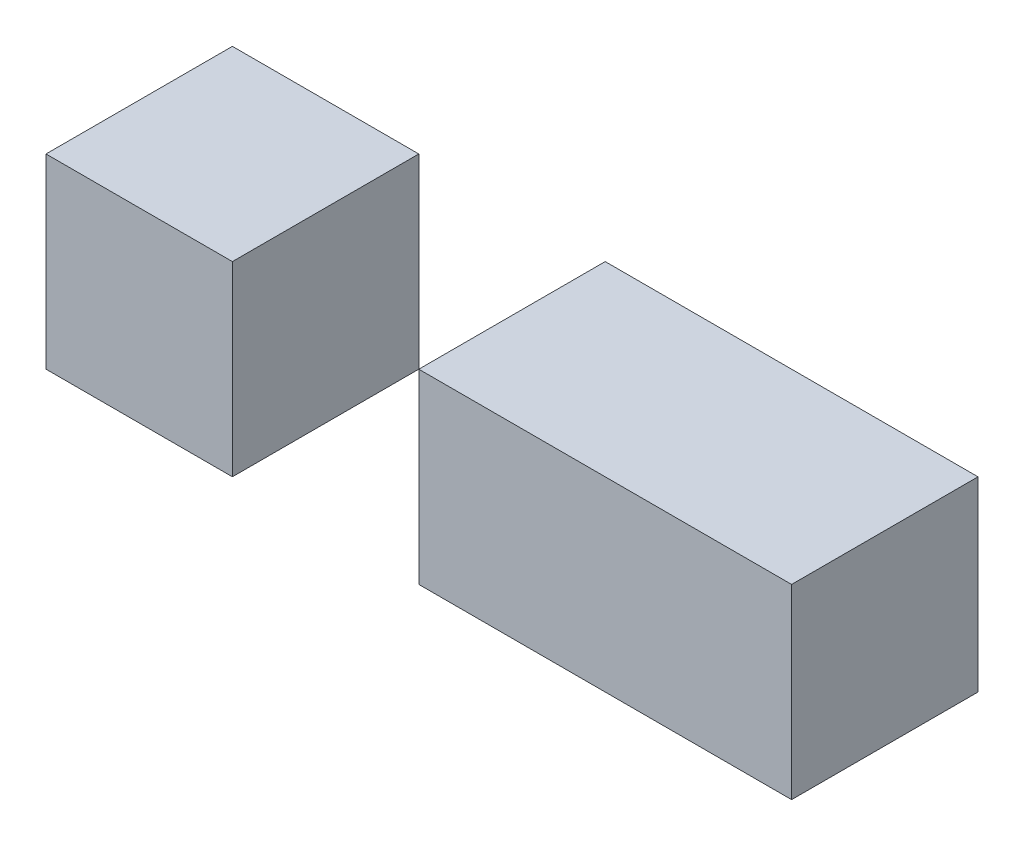
ISO-10303-21;
HEADER;
FILE_DESCRIPTION(('STEP AP214'),'2;1');
FILE_NAME('part.step','',(''),(''),'','','');
FILE_SCHEMA(('AUTOMOTIVE_DESIGN { 1 0 10303 214 1 1 1 1 }'));
ENDSEC;
DATA;
#1=APPLICATION_CONTEXT('core data for automotive mechanical design processes');
#2=APPLICATION_PROTOCOL_DEFINITION('international standard','automotive_design',2000,#1);
#3=PRODUCT_CONTEXT('',#1,'mechanical');
#4=PRODUCT('Part','Part','',(#3));
#5=PRODUCT_RELATED_PRODUCT_CATEGORY('part','',(#4));
#6=PRODUCT_DEFINITION_FORMATION('','',#4);
#7=PRODUCT_DEFINITION_CONTEXT('part definition',#1,'design');
#8=PRODUCT_DEFINITION('design','',#6,#7);
#9=PRODUCT_DEFINITION_SHAPE('','',#8);
#10=(LENGTH_UNIT() NAMED_UNIT(*) SI_UNIT(.MILLI.,.METRE.));
#11=(NAMED_UNIT(*) PLANE_ANGLE_UNIT() SI_UNIT($,.RADIAN.));
#12=(NAMED_UNIT(*) SI_UNIT($,.STERADIAN.) SOLID_ANGLE_UNIT());
#13=UNCERTAINTY_MEASURE_WITH_UNIT(LENGTH_MEASURE(1.E-05),#10,'distance_accuracy_value','');
#14=(GEOMETRIC_REPRESENTATION_CONTEXT(3) GLOBAL_UNCERTAINTY_ASSIGNED_CONTEXT((#13)) GLOBAL_UNIT_ASSIGNED_CONTEXT((#10,
#11,#12)) REPRESENTATION_CONTEXT('',''));
#15=CARTESIAN_POINT('',(0.,0.,0.));
#16=DIRECTION('',(0.,0.,1.));
#17=DIRECTION('',(1.,0.,0.));
#18=AXIS2_PLACEMENT_3D('',#15,#16,#17);
#19=CARTESIAN_POINT('',(20.,0.,10.));
#20=DIRECTION('',(1.,0.,0.));
#21=DIRECTION('',(0.,0.,-1.));
#22=AXIS2_PLACEMENT_3D('',#19,#20,#21);
#23=PLANE('',#22);
#24=DIRECTION('',(0.,-1.,0.));
#25=VECTOR('',#24,1.);
#26=CARTESIAN_POINT('',(20.,0.,0.));
#27=LINE('',#26,#25);
#28=CARTESIAN_POINT('',(20.,10.,0.));
#29=VERTEX_POINT('',#28);
#30=CARTESIAN_POINT('',(20.,0.,0.));
#31=VERTEX_POINT('',#30);
#32=EDGE_CURVE('E12',#29,#31,#27,.T.);
#33=ORIENTED_EDGE('',*,*,#32,.T.);
#34=DIRECTION('',(0.,0.,-1.));
#35=VECTOR('',#34,1.);
#36=CARTESIAN_POINT('',(20.,0.,10.));
#37=LINE('',#36,#35);
#38=CARTESIAN_POINT('',(20.,0.,10.));
#39=VERTEX_POINT('',#38);
#40=EDGE_CURVE('E125',#39,#31,#37,.T.);
#41=ORIENTED_EDGE('',*,*,#40,.F.);
#42=DIRECTION('',(0.,-1.,0.));
#43=VECTOR('',#42,1.);
#44=CARTESIAN_POINT('',(20.,0.,10.));
#45=LINE('',#44,#43);
#46=CARTESIAN_POINT('',(20.,10.,10.));
#47=VERTEX_POINT('',#46);
#48=EDGE_CURVE('E60',#47,#39,#45,.T.);
#49=ORIENTED_EDGE('',*,*,#48,.F.);
#50=DIRECTION('',(0.,0.,-1.));
#51=VECTOR('',#50,1.);
#52=CARTESIAN_POINT('',(20.,10.,10.));
#53=LINE('',#52,#51);
#54=EDGE_CURVE('E115',#47,#29,#53,.T.);
#55=ORIENTED_EDGE('',*,*,#54,.T.);
#56=EDGE_LOOP('',(#33,#41,#49,#55));
#57=FACE_BOUND('',#56,.T.);
#58=ADVANCED_FACE('F52',(#57),#23,.F.);
#59=CARTESIAN_POINT('',(20.,0.,10.));
#60=DIRECTION('',(0.,1.,0.));
#61=DIRECTION('',(0.,0.,1.));
#62=AXIS2_PLACEMENT_3D('',#59,#60,#61);
#63=PLANE('',#62);
#64=DIRECTION('',(1.,0.,0.));
#65=VECTOR('',#64,1.);
#66=CARTESIAN_POINT('',(20.,0.,0.));
#67=LINE('',#66,#65);
#68=CARTESIAN_POINT('',(40.,0.,0.));
#69=VERTEX_POINT('',#68);
#70=EDGE_CURVE('E62',#31,#69,#67,.T.);
#71=ORIENTED_EDGE('',*,*,#70,.T.);
#72=DIRECTION('',(0.,0.,-1.));
#73=VECTOR('',#72,1.);
#74=CARTESIAN_POINT('',(40.,0.,10.));
#75=LINE('',#74,#73);
#76=CARTESIAN_POINT('',(40.,0.,10.));
#77=VERTEX_POINT('',#76);
#78=EDGE_CURVE('E107',#77,#69,#75,.T.);
#79=ORIENTED_EDGE('',*,*,#78,.F.);
#80=DIRECTION('',(1.,0.,0.));
#81=VECTOR('',#80,1.);
#82=CARTESIAN_POINT('',(20.,0.,10.));
#83=LINE('',#82,#81);
#84=EDGE_CURVE('E87',#39,#77,#83,.T.);
#85=ORIENTED_EDGE('',*,*,#84,.F.);
#86=ORIENTED_EDGE('',*,*,#40,.T.);
#87=EDGE_LOOP('',(#71,#79,#85,#86));
#88=FACE_BOUND('',#87,.T.);
#89=ADVANCED_FACE('F130',(#88),#63,.F.);
#90=CARTESIAN_POINT('',(40.,0.,10.));
#91=DIRECTION('',(-1.,0.,0.));
#92=DIRECTION('',(0.,0.,1.));
#93=AXIS2_PLACEMENT_3D('',#90,#91,#92);
#94=PLANE('',#93);
#95=DIRECTION('',(0.,1.,0.));
#96=VECTOR('',#95,1.);
#97=CARTESIAN_POINT('',(40.,0.,0.));
#98=LINE('',#97,#96);
#99=CARTESIAN_POINT('',(40.,10.,0.));
#100=VERTEX_POINT('',#99);
#101=EDGE_CURVE('E103',#69,#100,#98,.T.);
#102=ORIENTED_EDGE('',*,*,#101,.T.);
#103=DIRECTION('',(0.,0.,-1.));
#104=VECTOR('',#103,1.);
#105=CARTESIAN_POINT('',(40.,10.,10.));
#106=LINE('',#105,#104);
#107=CARTESIAN_POINT('',(40.,10.,10.));
#108=VERTEX_POINT('',#107);
#109=EDGE_CURVE('E106',#108,#100,#106,.T.);
#110=ORIENTED_EDGE('',*,*,#109,.F.);
#111=DIRECTION('',(0.,1.,0.));
#112=VECTOR('',#111,1.);
#113=CARTESIAN_POINT('',(40.,0.,10.));
#114=LINE('',#113,#112);
#115=EDGE_CURVE('E116',#77,#108,#114,.T.);
#116=ORIENTED_EDGE('',*,*,#115,.F.);
#117=ORIENTED_EDGE('',*,*,#78,.T.);
#118=EDGE_LOOP('',(#102,#110,#116,#117));
#119=FACE_BOUND('',#118,.T.);
#120=ADVANCED_FACE('F102',(#119),#94,.F.);
#121=CARTESIAN_POINT('',(20.,10.,10.));
#122=DIRECTION('',(0.,-1.,0.));
#123=DIRECTION('',(0.,0.,-1.));
#124=AXIS2_PLACEMENT_3D('',#121,#122,#123);
#125=PLANE('',#124);
#126=DIRECTION('',(-1.,0.,0.));
#127=VECTOR('',#126,1.);
#128=CARTESIAN_POINT('',(20.,10.,0.));
#129=LINE('',#128,#127);
#130=EDGE_CURVE('E100',#100,#29,#129,.T.);
#131=ORIENTED_EDGE('',*,*,#130,.T.);
#132=ORIENTED_EDGE('',*,*,#54,.F.);
#133=DIRECTION('',(-1.,0.,0.));
#134=VECTOR('',#133,1.);
#135=CARTESIAN_POINT('',(20.,10.,10.));
#136=LINE('',#135,#134);
#137=EDGE_CURVE('E112',#108,#47,#136,.T.);
#138=ORIENTED_EDGE('',*,*,#137,.F.);
#139=ORIENTED_EDGE('',*,*,#109,.T.);
#140=EDGE_LOOP('',(#131,#132,#138,#139));
#141=FACE_BOUND('',#140,.T.);
#142=ADVANCED_FACE('F109',(#141),#125,.F.);
#143=CARTESIAN_POINT('',(0.,0.,10.));
#144=DIRECTION('',(0.,0.,-1.));
#145=DIRECTION('',(-1.,0.,0.));
#146=AXIS2_PLACEMENT_3D('',#143,#144,#145);
#147=PLANE('',#146);
#148=ORIENTED_EDGE('',*,*,#48,.T.);
#149=ORIENTED_EDGE('',*,*,#84,.T.);
#150=ORIENTED_EDGE('',*,*,#115,.T.);
#151=ORIENTED_EDGE('',*,*,#137,.T.);
#152=EDGE_LOOP('',(#148,#149,#150,#151));
#153=FACE_BOUND('',#152,.T.);
#154=ADVANCED_FACE('F54',(#153),#147,.F.);
#155=CARTESIAN_POINT('',(0.,0.,0.));
#156=DIRECTION('',(0.,0.,-1.));
#157=DIRECTION('',(-1.,0.,0.));
#158=AXIS2_PLACEMENT_3D('',#155,#156,#157);
#159=PLANE('',#158);
#160=ORIENTED_EDGE('',*,*,#32,.F.);
#161=ORIENTED_EDGE('',*,*,#130,.F.);
#162=ORIENTED_EDGE('',*,*,#101,.F.);
#163=ORIENTED_EDGE('',*,*,#70,.F.);
#164=EDGE_LOOP('',(#160,#161,#162,#163));
#165=FACE_BOUND('',#164,.T.);
#166=ADVANCED_FACE('F111',(#165),#159,.T.);
#167=CLOSED_SHELL('',(#58,#89,#120,#142,#154,#166));
#168=MANIFOLD_SOLID_BREP('B2',#167);
#169=CARTESIAN_POINT('',(0.,0.,10.));
#170=DIRECTION('',(1.,0.,0.));
#171=DIRECTION('',(0.,0.,-1.));
#172=AXIS2_PLACEMENT_3D('',#169,#170,#171);
#173=PLANE('',#172);
#174=DIRECTION('',(0.,-1.,0.));
#175=VECTOR('',#174,1.);
#176=CARTESIAN_POINT('',(0.,0.,0.));
#177=LINE('',#176,#175);
#178=CARTESIAN_POINT('',(0.,10.,0.));
#179=VERTEX_POINT('',#178);
#180=CARTESIAN_POINT('',(0.,0.,0.));
#181=VERTEX_POINT('',#180);
#182=EDGE_CURVE('E238',#179,#181,#177,.T.);
#183=ORIENTED_EDGE('',*,*,#182,.T.);
#184=DIRECTION('',(0.,0.,-1.));
#185=VECTOR('',#184,1.);
#186=CARTESIAN_POINT('',(0.,0.,10.));
#187=LINE('',#186,#185);
#188=CARTESIAN_POINT('',(0.,0.,10.));
#189=VERTEX_POINT('',#188);
#190=EDGE_CURVE('E51',#189,#181,#187,.T.);
#191=ORIENTED_EDGE('',*,*,#190,.F.);
#192=DIRECTION('',(0.,-1.,0.));
#193=VECTOR('',#192,1.);
#194=CARTESIAN_POINT('',(0.,0.,10.));
#195=LINE('',#194,#193);
#196=CARTESIAN_POINT('',(0.,10.,10.));
#197=VERTEX_POINT('',#196);
#198=EDGE_CURVE('E227',#197,#189,#195,.T.);
#199=ORIENTED_EDGE('',*,*,#198,.F.);
#200=DIRECTION('',(0.,0.,-1.));
#201=VECTOR('',#200,1.);
#202=CARTESIAN_POINT('',(0.,10.,10.));
#203=LINE('',#202,#201);
#204=EDGE_CURVE('E237',#197,#179,#203,.T.);
#205=ORIENTED_EDGE('',*,*,#204,.T.);
#206=EDGE_LOOP('',(#183,#191,#199,#205));
#207=FACE_BOUND('',#206,.T.);
#208=ADVANCED_FACE('F179',(#207),#173,.F.);
#209=CARTESIAN_POINT('',(0.,0.,10.));
#210=DIRECTION('',(0.,1.,0.));
#211=DIRECTION('',(0.,0.,1.));
#212=AXIS2_PLACEMENT_3D('',#209,#210,#211);
#213=PLANE('',#212);
#214=DIRECTION('',(1.,0.,0.));
#215=VECTOR('',#214,1.);
#216=CARTESIAN_POINT('',(0.,0.,0.));
#217=LINE('',#216,#215);
#218=CARTESIAN_POINT('',(10.,0.,0.));
#219=VERTEX_POINT('',#218);
#220=EDGE_CURVE('E234',#181,#219,#217,.T.);
#221=ORIENTED_EDGE('',*,*,#220,.T.);
#222=DIRECTION('',(0.,0.,-1.));
#223=VECTOR('',#222,1.);
#224=CARTESIAN_POINT('',(10.,0.,10.));
#225=LINE('',#224,#223);
#226=CARTESIAN_POINT('',(10.,0.,10.));
#227=VERTEX_POINT('',#226);
#228=EDGE_CURVE('E183',#227,#219,#225,.T.);
#229=ORIENTED_EDGE('',*,*,#228,.F.);
#230=DIRECTION('',(1.,0.,0.));
#231=VECTOR('',#230,1.);
#232=CARTESIAN_POINT('',(0.,0.,10.));
#233=LINE('',#232,#231);
#234=EDGE_CURVE('E224',#189,#227,#233,.T.);
#235=ORIENTED_EDGE('',*,*,#234,.F.);
#236=ORIENTED_EDGE('',*,*,#190,.T.);
#237=EDGE_LOOP('',(#221,#229,#235,#236));
#238=FACE_BOUND('',#237,.T.);
#239=ADVANCED_FACE('F233',(#238),#213,.F.);
#240=CARTESIAN_POINT('',(10.,0.,10.));
#241=DIRECTION('',(-1.,0.,0.));
#242=DIRECTION('',(0.,0.,1.));
#243=AXIS2_PLACEMENT_3D('',#240,#241,#242);
#244=PLANE('',#243);
#245=DIRECTION('',(0.,1.,0.));
#246=VECTOR('',#245,1.);
#247=CARTESIAN_POINT('',(10.,0.,0.));
#248=LINE('',#247,#246);
#249=CARTESIAN_POINT('',(10.,10.,0.));
#250=VERTEX_POINT('',#249);
#251=EDGE_CURVE('E209',#219,#250,#248,.T.);
#252=ORIENTED_EDGE('',*,*,#251,.T.);
#253=DIRECTION('',(0.,0.,-1.));
#254=VECTOR('',#253,1.);
#255=CARTESIAN_POINT('',(10.,10.,10.));
#256=LINE('',#255,#254);
#257=CARTESIAN_POINT('',(10.,10.,10.));
#258=VERTEX_POINT('',#257);
#259=EDGE_CURVE('E232',#258,#250,#256,.T.);
#260=ORIENTED_EDGE('',*,*,#259,.F.);
#261=DIRECTION('',(0.,1.,0.));
#262=VECTOR('',#261,1.);
#263=CARTESIAN_POINT('',(10.,0.,10.));
#264=LINE('',#263,#262);
#265=EDGE_CURVE('E228',#227,#258,#264,.T.);
#266=ORIENTED_EDGE('',*,*,#265,.F.);
#267=ORIENTED_EDGE('',*,*,#228,.T.);
#268=EDGE_LOOP('',(#252,#260,#266,#267));
#269=FACE_BOUND('',#268,.T.);
#270=ADVANCED_FACE('F235',(#269),#244,.F.);
#271=CARTESIAN_POINT('',(0.,10.,10.));
#272=DIRECTION('',(0.,-1.,0.));
#273=DIRECTION('',(0.,0.,-1.));
#274=AXIS2_PLACEMENT_3D('',#271,#272,#273);
#275=PLANE('',#274);
#276=DIRECTION('',(-1.,0.,0.));
#277=VECTOR('',#276,1.);
#278=CARTESIAN_POINT('',(0.,10.,0.));
#279=LINE('',#278,#277);
#280=EDGE_CURVE('E216',#250,#179,#279,.T.);
#281=ORIENTED_EDGE('',*,*,#280,.T.);
#282=ORIENTED_EDGE('',*,*,#204,.F.);
#283=DIRECTION('',(-1.,0.,0.));
#284=VECTOR('',#283,1.);
#285=CARTESIAN_POINT('',(0.,10.,10.));
#286=LINE('',#285,#284);
#287=EDGE_CURVE('E192',#258,#197,#286,.T.);
#288=ORIENTED_EDGE('',*,*,#287,.F.);
#289=ORIENTED_EDGE('',*,*,#259,.T.);
#290=EDGE_LOOP('',(#281,#282,#288,#289));
#291=FACE_BOUND('',#290,.T.);
#292=ADVANCED_FACE('F249',(#291),#275,.F.);
#293=CARTESIAN_POINT('',(0.,0.,10.));
#294=DIRECTION('',(0.,0.,-1.));
#295=DIRECTION('',(-1.,0.,0.));
#296=AXIS2_PLACEMENT_3D('',#293,#294,#295);
#297=PLANE('',#296);
#298=ORIENTED_EDGE('',*,*,#198,.T.);
#299=ORIENTED_EDGE('',*,*,#234,.T.);
#300=ORIENTED_EDGE('',*,*,#265,.T.);
#301=ORIENTED_EDGE('',*,*,#287,.T.);
#302=EDGE_LOOP('',(#298,#299,#300,#301));
#303=FACE_BOUND('',#302,.T.);
#304=ADVANCED_FACE('F221',(#303),#297,.F.);
#305=CARTESIAN_POINT('',(0.,0.,0.));
#306=DIRECTION('',(0.,0.,-1.));
#307=DIRECTION('',(-1.,0.,0.));
#308=AXIS2_PLACEMENT_3D('',#305,#306,#307);
#309=PLANE('',#308);
#310=ORIENTED_EDGE('',*,*,#182,.F.);
#311=ORIENTED_EDGE('',*,*,#280,.F.);
#312=ORIENTED_EDGE('',*,*,#251,.F.);
#313=ORIENTED_EDGE('',*,*,#220,.F.);
#314=EDGE_LOOP('',(#310,#311,#312,#313));
#315=FACE_BOUND('',#314,.T.);
#316=ADVANCED_FACE('F246',(#315),#309,.T.);
#317=CLOSED_SHELL('',(#208,#239,#270,#292,#304,#316));
#318=MANIFOLD_SOLID_BREP('B6',#317);
#319=ADVANCED_BREP_SHAPE_REPRESENTATION('',(#18,#168,#318),#14);
#320=SHAPE_DEFINITION_REPRESENTATION(#9,#319);
ENDSEC;
END-ISO-10303-21;
